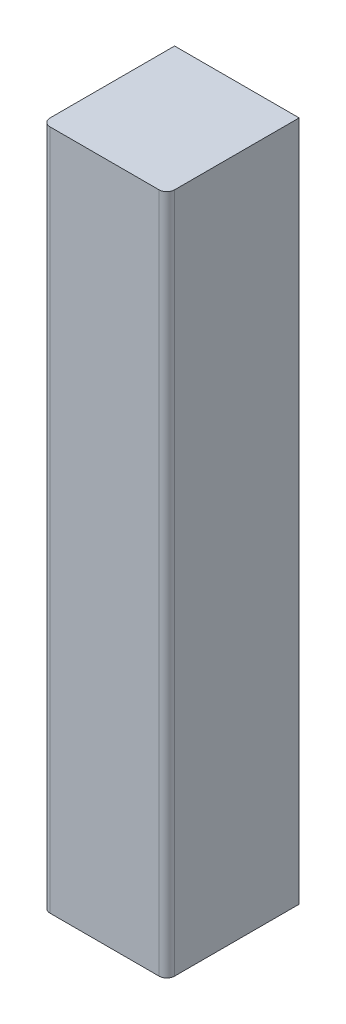
ISO-10303-21;
HEADER;
FILE_DESCRIPTION(('STEP AP214'),'2;1');
FILE_NAME('part.step','',(''),(''),'','','');
FILE_SCHEMA(('AUTOMOTIVE_DESIGN { 1 0 10303 214 1 1 1 1 }'));
ENDSEC;
DATA;
#1=APPLICATION_CONTEXT('core data for automotive mechanical design processes');
#2=APPLICATION_PROTOCOL_DEFINITION('international standard','automotive_design',2000,#1);
#3=PRODUCT_CONTEXT('',#1,'mechanical');
#4=PRODUCT('Part','Part','',(#3));
#5=PRODUCT_RELATED_PRODUCT_CATEGORY('part','',(#4));
#6=PRODUCT_DEFINITION_FORMATION('','',#4);
#7=PRODUCT_DEFINITION_CONTEXT('part definition',#1,'design');
#8=PRODUCT_DEFINITION('design','',#6,#7);
#9=PRODUCT_DEFINITION_SHAPE('','',#8);
#10=(LENGTH_UNIT() NAMED_UNIT(*) SI_UNIT(.MILLI.,.METRE.));
#11=(NAMED_UNIT(*) PLANE_ANGLE_UNIT() SI_UNIT($,.RADIAN.));
#12=(NAMED_UNIT(*) SI_UNIT($,.STERADIAN.) SOLID_ANGLE_UNIT());
#13=UNCERTAINTY_MEASURE_WITH_UNIT(LENGTH_MEASURE(1.E-05),#10,'distance_accuracy_value','');
#14=(GEOMETRIC_REPRESENTATION_CONTEXT(3) GLOBAL_UNCERTAINTY_ASSIGNED_CONTEXT((#13)) GLOBAL_UNIT_ASSIGNED_CONTEXT((#10,
#11,#12)) REPRESENTATION_CONTEXT('',''));
#15=CARTESIAN_POINT('',(0.,0.,0.));
#16=DIRECTION('',(0.,0.,1.));
#17=DIRECTION('',(1.,0.,0.));
#18=AXIS2_PLACEMENT_3D('',#15,#16,#17);
#19=CARTESIAN_POINT('',(-8.,43.75,0.1));
#20=DIRECTION('',(1.,0.,0.));
#21=DIRECTION('',(0.,1.,0.));
#22=AXIS2_PLACEMENT_3D('',#19,#20,#21);
#23=PLANE('',#22);
#24=DIRECTION('',(0.,0.,-1.));
#25=VECTOR('',#24,1.);
#26=CARTESIAN_POINT('',(-8.,-43.75,0.1));
#27=LINE('',#26,#25);
#28=CARTESIAN_POINT('',(-8.,-43.75,16.));
#29=VERTEX_POINT('',#28);
#30=CARTESIAN_POINT('',(-8.,-43.75,0.));
#31=VERTEX_POINT('',#30);
#32=EDGE_CURVE('E89',#29,#31,#27,.T.);
#33=ORIENTED_EDGE('',*,*,#32,.F.);
#34=DIRECTION('',(0.,-1.,0.));
#35=VECTOR('',#34,1.);
#36=CARTESIAN_POINT('',(-8.,43.75,16.));
#37=LINE('',#36,#35);
#38=CARTESIAN_POINT('',(-8.,43.75,16.));
#39=VERTEX_POINT('',#38);
#40=EDGE_CURVE('E60',#29,#39,#37,.F.);
#41=ORIENTED_EDGE('',*,*,#40,.T.);
#42=DIRECTION('',(0.,0.,-1.));
#43=VECTOR('',#42,1.);
#44=CARTESIAN_POINT('',(-8.,43.75,0.1));
#45=LINE('',#44,#43);
#46=CARTESIAN_POINT('',(-8.,43.75,0.));
#47=VERTEX_POINT('',#46);
#48=EDGE_CURVE('E109',#39,#47,#45,.T.);
#49=ORIENTED_EDGE('',*,*,#48,.T.);
#50=DIRECTION('',(0.,-1.,0.));
#51=VECTOR('',#50,1.);
#52=CARTESIAN_POINT('',(-8.,43.75,0.));
#53=LINE('',#52,#51);
#54=EDGE_CURVE('E105',#47,#31,#53,.T.);
#55=ORIENTED_EDGE('',*,*,#54,.T.);
#56=EDGE_LOOP('',(#33,#41,#49,#55));
#57=FACE_BOUND('',#56,.T.);
#58=ADVANCED_FACE('F37',(#57),#23,.F.);
#59=CARTESIAN_POINT('',(-8.,-43.75,0.1));
#60=DIRECTION('',(0.,1.,0.));
#61=DIRECTION('',(0.,0.,1.));
#62=AXIS2_PLACEMENT_3D('',#59,#60,#61);
#63=PLANE('',#62);
#64=DIRECTION('',(1.,0.,0.));
#65=VECTOR('',#64,1.);
#66=CARTESIAN_POINT('',(-7.99999999999999,-43.75,17.));
#67=LINE('',#66,#65);
#68=CARTESIAN_POINT('',(-7.,-43.75,17.));
#69=VERTEX_POINT('',#68);
#70=CARTESIAN_POINT('',(7.00000000000002,-43.75,17.));
#71=VERTEX_POINT('',#70);
#72=EDGE_CURVE('E114',#69,#71,#67,.T.);
#73=ORIENTED_EDGE('',*,*,#72,.F.);
#74=CARTESIAN_POINT('',(-7.,-43.75,16.));
#75=DIRECTION('',(0.,1.,0.));
#76=DIRECTION('',(0.,0.,1.));
#77=AXIS2_PLACEMENT_3D('',#74,#75,#76);
#78=CIRCLE('',#77,1.);
#79=EDGE_CURVE('E96',#69,#29,#78,.F.);
#80=ORIENTED_EDGE('',*,*,#79,.T.);
#81=ORIENTED_EDGE('',*,*,#32,.T.);
#82=DIRECTION('',(1.,0.,0.));
#83=VECTOR('',#82,1.);
#84=CARTESIAN_POINT('',(-8.,-43.75,0.));
#85=LINE('',#84,#83);
#86=CARTESIAN_POINT('',(8.00000000000002,-43.75,0.));
#87=VERTEX_POINT('',#86);
#88=EDGE_CURVE('E94',#31,#87,#85,.T.);
#89=ORIENTED_EDGE('',*,*,#88,.T.);
#90=DIRECTION('',(0.,0.,-1.));
#91=VECTOR('',#90,1.);
#92=CARTESIAN_POINT('',(8.00000000000002,-43.75,0.1));
#93=LINE('',#92,#91);
#94=CARTESIAN_POINT('',(8.00000000000002,-43.75,16.));
#95=VERTEX_POINT('',#94);
#96=EDGE_CURVE('E99',#95,#87,#93,.T.);
#97=ORIENTED_EDGE('',*,*,#96,.F.);
#98=CARTESIAN_POINT('',(7.00000000000002,-43.75,16.));
#99=DIRECTION('',(0.,1.,0.));
#100=DIRECTION('',(0.,0.,1.));
#101=AXIS2_PLACEMENT_3D('',#98,#99,#100);
#102=CIRCLE('',#101,1.);
#103=EDGE_CURVE('E130',#95,#71,#102,.F.);
#104=ORIENTED_EDGE('',*,*,#103,.T.);
#105=EDGE_LOOP('',(#73,#80,#81,#89,#97,#104));
#106=FACE_BOUND('',#105,.T.);
#107=ADVANCED_FACE('F92',(#106),#63,.F.);
#108=CARTESIAN_POINT('',(8.00000000000002,-43.75,0.1));
#109=DIRECTION('',(-1.,0.,0.));
#110=DIRECTION('',(0.,-1.,0.));
#111=AXIS2_PLACEMENT_3D('',#108,#109,#110);
#112=PLANE('',#111);
#113=DIRECTION('',(0.,0.,-1.));
#114=VECTOR('',#113,1.);
#115=CARTESIAN_POINT('',(8.,43.75,0.1));
#116=LINE('',#115,#114);
#117=CARTESIAN_POINT('',(8.,43.75,16.));
#118=VERTEX_POINT('',#117);
#119=CARTESIAN_POINT('',(8.,43.75,0.));
#120=VERTEX_POINT('',#119);
#121=EDGE_CURVE('E122',#118,#120,#116,.T.);
#122=ORIENTED_EDGE('',*,*,#121,.F.);
#123=DIRECTION('',(0.,1.,0.));
#124=VECTOR('',#123,1.);
#125=CARTESIAN_POINT('',(8.00000000000002,-43.75,16.));
#126=LINE('',#125,#124);
#127=EDGE_CURVE('E11',#118,#95,#126,.F.);
#128=ORIENTED_EDGE('',*,*,#127,.T.);
#129=ORIENTED_EDGE('',*,*,#96,.T.);
#130=DIRECTION('',(0.,1.,0.));
#131=VECTOR('',#130,1.);
#132=CARTESIAN_POINT('',(8.00000000000002,-43.75,0.));
#133=LINE('',#132,#131);
#134=EDGE_CURVE('E107',#87,#120,#133,.T.);
#135=ORIENTED_EDGE('',*,*,#134,.T.);
#136=EDGE_LOOP('',(#122,#128,#129,#135));
#137=FACE_BOUND('',#136,.T.);
#138=ADVANCED_FACE('F155',(#137),#112,.F.);
#139=CARTESIAN_POINT('',(-8.,43.75,0.1));
#140=DIRECTION('',(0.,-1.,0.));
#141=DIRECTION('',(0.,0.,-1.));
#142=AXIS2_PLACEMENT_3D('',#139,#140,#141);
#143=PLANE('',#142);
#144=ORIENTED_EDGE('',*,*,#48,.F.);
#145=CARTESIAN_POINT('',(-7.,43.75,16.));
#146=DIRECTION('',(0.,-1.,0.));
#147=DIRECTION('',(0.,0.,-1.));
#148=AXIS2_PLACEMENT_3D('',#145,#146,#147);
#149=CIRCLE('',#148,1.);
#150=CARTESIAN_POINT('',(-7.,43.75,17.));
#151=VERTEX_POINT('',#150);
#152=EDGE_CURVE('E45',#39,#151,#149,.F.);
#153=ORIENTED_EDGE('',*,*,#152,.T.);
#154=DIRECTION('',(-1.,0.,0.));
#155=VECTOR('',#154,1.);
#156=CARTESIAN_POINT('',(-8.,43.75,17.));
#157=LINE('',#156,#155);
#158=CARTESIAN_POINT('',(7.,43.75,17.));
#159=VERTEX_POINT('',#158);
#160=EDGE_CURVE('E111',#159,#151,#157,.T.);
#161=ORIENTED_EDGE('',*,*,#160,.F.);
#162=CARTESIAN_POINT('',(7.,43.75,16.));
#163=DIRECTION('',(0.,-1.,0.));
#164=DIRECTION('',(0.,0.,-1.));
#165=AXIS2_PLACEMENT_3D('',#162,#163,#164);
#166=CIRCLE('',#165,1.);
#167=EDGE_CURVE('E52',#159,#118,#166,.F.);
#168=ORIENTED_EDGE('',*,*,#167,.T.);
#169=ORIENTED_EDGE('',*,*,#121,.T.);
#170=DIRECTION('',(-1.,0.,0.));
#171=VECTOR('',#170,1.);
#172=CARTESIAN_POINT('',(-8.,43.75,0.));
#173=LINE('',#172,#171);
#174=EDGE_CURVE('E119',#120,#47,#173,.T.);
#175=ORIENTED_EDGE('',*,*,#174,.T.);
#176=EDGE_LOOP('',(#144,#153,#161,#168,#169,#175));
#177=FACE_BOUND('',#176,.T.);
#178=ADVANCED_FACE('F135',(#177),#143,.F.);
#179=CARTESIAN_POINT('',(-8.,-43.75,0.));
#180=DIRECTION('',(0.,0.,1.));
#181=DIRECTION('',(1.,0.,0.));
#182=AXIS2_PLACEMENT_3D('',#179,#180,#181);
#183=PLANE('',#182);
#184=ORIENTED_EDGE('',*,*,#54,.F.);
#185=ORIENTED_EDGE('',*,*,#174,.F.);
#186=ORIENTED_EDGE('',*,*,#134,.F.);
#187=ORIENTED_EDGE('',*,*,#88,.F.);
#188=EDGE_LOOP('',(#184,#185,#186,#187));
#189=FACE_BOUND('',#188,.T.);
#190=ADVANCED_FACE('F103',(#189),#183,.F.);
#191=CARTESIAN_POINT('',(-7.99999999999999,-43.75,17.));
#192=DIRECTION('',(0.,0.,1.));
#193=DIRECTION('',(1.,0.,0.));
#194=AXIS2_PLACEMENT_3D('',#191,#192,#193);
#195=PLANE('',#194);
#196=ORIENTED_EDGE('',*,*,#160,.T.);
#197=DIRECTION('',(0.,-1.,0.));
#198=VECTOR('',#197,1.);
#199=CARTESIAN_POINT('',(-7.,-43.75,17.));
#200=LINE('',#199,#198);
#201=EDGE_CURVE('E127',#151,#69,#200,.T.);
#202=ORIENTED_EDGE('',*,*,#201,.T.);
#203=ORIENTED_EDGE('',*,*,#72,.T.);
#204=DIRECTION('',(0.,1.,0.));
#205=VECTOR('',#204,1.);
#206=CARTESIAN_POINT('',(7.,43.75,17.));
#207=LINE('',#206,#205);
#208=EDGE_CURVE('E98',#71,#159,#207,.T.);
#209=ORIENTED_EDGE('',*,*,#208,.T.);
#210=EDGE_LOOP('',(#196,#202,#203,#209));
#211=FACE_BOUND('',#210,.T.);
#212=ADVANCED_FACE('F139',(#211),#195,.T.);
#213=CARTESIAN_POINT('',(-7.,-43.75,16.));
#214=DIRECTION('',(0.,1.,0.));
#215=DIRECTION('',(-1.,0.,0.));
#216=AXIS2_PLACEMENT_3D('',#213,#214,#215);
#217=CYLINDRICAL_SURFACE('',#216,1.);
#218=ORIENTED_EDGE('',*,*,#152,.F.);
#219=ORIENTED_EDGE('',*,*,#40,.F.);
#220=ORIENTED_EDGE('',*,*,#79,.F.);
#221=ORIENTED_EDGE('',*,*,#201,.F.);
#222=EDGE_LOOP('',(#218,#219,#220,#221));
#223=FACE_BOUND('',#222,.T.);
#224=ADVANCED_FACE('F142',(#223),#217,.T.);
#225=CARTESIAN_POINT('',(7.00000000000002,-43.75,16.));
#226=DIRECTION('',(0.,-1.,0.));
#227=DIRECTION('',(1.,0.,0.));
#228=AXIS2_PLACEMENT_3D('',#225,#226,#227);
#229=CYLINDRICAL_SURFACE('',#228,1.);
#230=ORIENTED_EDGE('',*,*,#103,.F.);
#231=ORIENTED_EDGE('',*,*,#127,.F.);
#232=ORIENTED_EDGE('',*,*,#167,.F.);
#233=ORIENTED_EDGE('',*,*,#208,.F.);
#234=EDGE_LOOP('',(#230,#231,#232,#233));
#235=FACE_BOUND('',#234,.T.);
#236=ADVANCED_FACE('F39',(#235),#229,.T.);
#237=CLOSED_SHELL('',(#58,#107,#138,#178,#190,#212,#224,#236));
#238=MANIFOLD_SOLID_BREP('B2',#237);
#239=ADVANCED_BREP_SHAPE_REPRESENTATION('',(#18,#238),#14);
#240=SHAPE_DEFINITION_REPRESENTATION(#9,#239);
ENDSEC;
END-ISO-10303-21;
